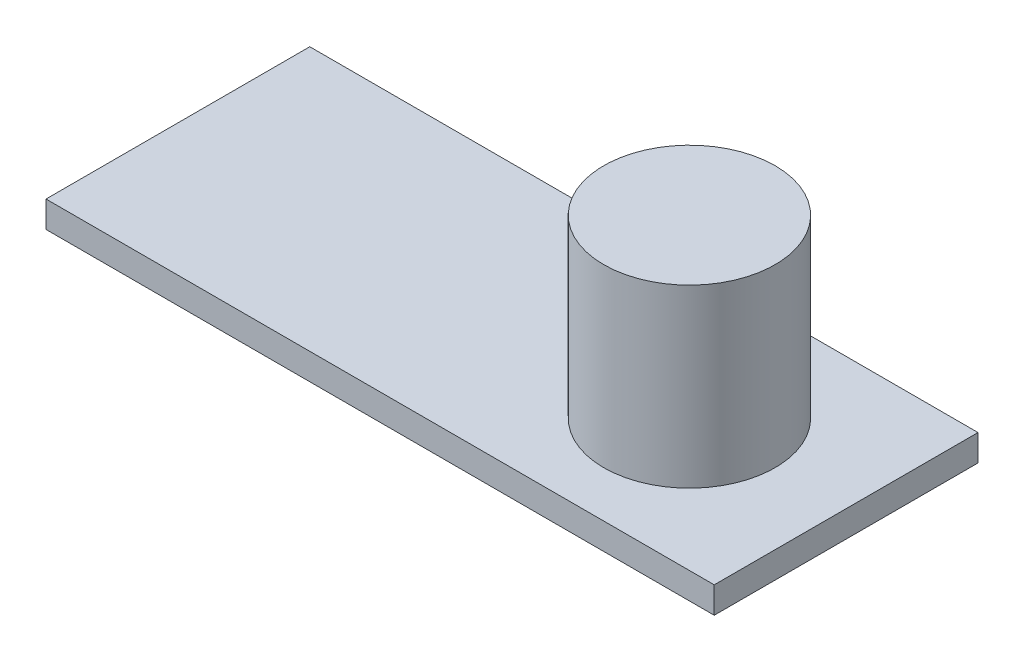
ISO-10303-21;
HEADER;
FILE_DESCRIPTION(('STEP AP214'),'2;1');
FILE_NAME('part.step','',(''),(''),'','','');
FILE_SCHEMA(('AUTOMOTIVE_DESIGN { 1 0 10303 214 1 1 1 1 }'));
ENDSEC;
DATA;
#1=APPLICATION_CONTEXT('core data for automotive mechanical design processes');
#2=APPLICATION_PROTOCOL_DEFINITION('international standard','automotive_design',2000,#1);
#3=PRODUCT_CONTEXT('',#1,'mechanical');
#4=PRODUCT('Part','Part','',(#3));
#5=PRODUCT_RELATED_PRODUCT_CATEGORY('part','',(#4));
#6=PRODUCT_DEFINITION_FORMATION('','',#4);
#7=PRODUCT_DEFINITION_CONTEXT('part definition',#1,'design');
#8=PRODUCT_DEFINITION('design','',#6,#7);
#9=PRODUCT_DEFINITION_SHAPE('','',#8);
#10=(LENGTH_UNIT() NAMED_UNIT(*) SI_UNIT(.MILLI.,.METRE.));
#11=(NAMED_UNIT(*) PLANE_ANGLE_UNIT() SI_UNIT($,.RADIAN.));
#12=(NAMED_UNIT(*) SI_UNIT($,.STERADIAN.) SOLID_ANGLE_UNIT());
#13=UNCERTAINTY_MEASURE_WITH_UNIT(LENGTH_MEASURE(1.E-05),#10,'distance_accuracy_value','');
#14=(GEOMETRIC_REPRESENTATION_CONTEXT(3) GLOBAL_UNCERTAINTY_ASSIGNED_CONTEXT((#13)) GLOBAL_UNIT_ASSIGNED_CONTEXT((#10,
#11,#12)) REPRESENTATION_CONTEXT('',''));
#15=CARTESIAN_POINT('',(0.,0.,0.));
#16=DIRECTION('',(0.,0.,1.));
#17=DIRECTION('',(1.,0.,0.));
#18=AXIS2_PLACEMENT_3D('',#15,#16,#17);
#19=CARTESIAN_POINT('',(0.,-1.5,0.));
#20=DIRECTION('',(0.,1.,0.));
#21=DIRECTION('',(0.,0.,1.));
#22=AXIS2_PLACEMENT_3D('',#19,#20,#21);
#23=PLANE('',#22);
#24=DIRECTION('',(-1.,0.,0.));
#25=VECTOR('',#24,1.);
#26=CARTESIAN_POINT('',(0.,-1.5,-7.5));
#27=LINE('',#26,#25);
#28=CARTESIAN_POINT('',(19.,-1.5,-7.5));
#29=VERTEX_POINT('',#28);
#30=CARTESIAN_POINT('',(-19.,-1.5,-7.5));
#31=VERTEX_POINT('',#30);
#32=EDGE_CURVE('E165',#29,#31,#27,.T.);
#33=ORIENTED_EDGE('',*,*,#32,.F.);
#34=DIRECTION('',(0.,0.,1.));
#35=VECTOR('',#34,1.);
#36=CARTESIAN_POINT('',(19.,-1.5,0.));
#37=LINE('',#36,#35);
#38=CARTESIAN_POINT('',(19.,-1.5,7.5));
#39=VERTEX_POINT('',#38);
#40=EDGE_CURVE('E152',#29,#39,#37,.T.);
#41=ORIENTED_EDGE('',*,*,#40,.T.);
#42=DIRECTION('',(-1.,0.,0.));
#43=VECTOR('',#42,1.);
#44=CARTESIAN_POINT('',(0.,-1.5,7.5));
#45=LINE('',#44,#43);
#46=CARTESIAN_POINT('',(-19.,-1.5,7.5));
#47=VERTEX_POINT('',#46);
#48=EDGE_CURVE('E148',#39,#47,#45,.T.);
#49=ORIENTED_EDGE('',*,*,#48,.T.);
#50=DIRECTION('',(0.,0.,1.));
#51=VECTOR('',#50,1.);
#52=CARTESIAN_POINT('',(-19.,-1.5,0.));
#53=LINE('',#52,#51);
#54=EDGE_CURVE('E151',#31,#47,#53,.T.);
#55=ORIENTED_EDGE('',*,*,#54,.F.);
#56=EDGE_LOOP('',(#33,#41,#49,#55));
#57=FACE_BOUND('',#56,.T.);
#58=ADVANCED_FACE('F101',(#57),#23,.F.);
#59=CARTESIAN_POINT('',(0.,0.,0.));
#60=DIRECTION('',(0.,1.,0.));
#61=DIRECTION('',(0.,0.,1.));
#62=AXIS2_PLACEMENT_3D('',#59,#60,#61);
#63=PLANE('',#62);
#64=CARTESIAN_POINT('',(10.09,0.,0.));
#65=DIRECTION('',(0.,1.,0.));
#66=DIRECTION('',(0.,0.,1.));
#67=AXIS2_PLACEMENT_3D('',#64,#65,#66);
#68=CIRCLE('',#67,4.875);
#69=CARTESIAN_POINT('',(10.09,0.,4.875));
#70=VERTEX_POINT('',#69);
#71=EDGE_CURVE('E289',#70,#70,#68,.T.);
#72=ORIENTED_EDGE('',*,*,#71,.F.);
#73=EDGE_LOOP('',(#72));
#74=FACE_BOUND('',#73,.T.);
#75=DIRECTION('',(-1.,0.,0.));
#76=VECTOR('',#75,1.);
#77=CARTESIAN_POINT('',(0.,0.,-7.5));
#78=LINE('',#77,#76);
#79=CARTESIAN_POINT('',(19.,0.,-7.5));
#80=VERTEX_POINT('',#79);
#81=CARTESIAN_POINT('',(-19.,0.,-7.5));
#82=VERTEX_POINT('',#81);
#83=EDGE_CURVE('E173',#80,#82,#78,.T.);
#84=ORIENTED_EDGE('',*,*,#83,.T.);
#85=DIRECTION('',(0.,0.,1.));
#86=VECTOR('',#85,1.);
#87=CARTESIAN_POINT('',(-19.,0.,0.));
#88=LINE('',#87,#86);
#89=CARTESIAN_POINT('',(-19.,0.,7.5));
#90=VERTEX_POINT('',#89);
#91=EDGE_CURVE('E177',#82,#90,#88,.T.);
#92=ORIENTED_EDGE('',*,*,#91,.T.);
#93=DIRECTION('',(-1.,0.,0.));
#94=VECTOR('',#93,1.);
#95=CARTESIAN_POINT('',(0.,0.,7.5));
#96=LINE('',#95,#94);
#97=CARTESIAN_POINT('',(19.,0.,7.5));
#98=VERTEX_POINT('',#97);
#99=EDGE_CURVE('E160',#98,#90,#96,.T.);
#100=ORIENTED_EDGE('',*,*,#99,.F.);
#101=DIRECTION('',(0.,0.,1.));
#102=VECTOR('',#101,1.);
#103=CARTESIAN_POINT('',(19.,0.,0.));
#104=LINE('',#103,#102);
#105=EDGE_CURVE('E136',#80,#98,#104,.T.);
#106=ORIENTED_EDGE('',*,*,#105,.F.);
#107=EDGE_LOOP('',(#84,#92,#100,#106));
#108=FACE_BOUND('',#107,.T.);
#109=ADVANCED_FACE('F187',(#74,#108),#63,.T.);
#110=CARTESIAN_POINT('',(19.,-1.5,0.));
#111=DIRECTION('',(-1.,0.,0.));
#112=DIRECTION('',(0.,0.,1.));
#113=AXIS2_PLACEMENT_3D('',#110,#111,#112);
#114=PLANE('',#113);
#115=ORIENTED_EDGE('',*,*,#105,.T.);
#116=DIRECTION('',(0.,1.,0.));
#117=VECTOR('',#116,1.);
#118=CARTESIAN_POINT('',(19.,-1.5,7.5));
#119=LINE('',#118,#117);
#120=EDGE_CURVE('E112',#39,#98,#119,.T.);
#121=ORIENTED_EDGE('',*,*,#120,.F.);
#122=ORIENTED_EDGE('',*,*,#40,.F.);
#123=DIRECTION('',(0.,1.,0.));
#124=VECTOR('',#123,1.);
#125=CARTESIAN_POINT('',(19.,-1.5,-7.5));
#126=LINE('',#125,#124);
#127=EDGE_CURVE('E12',#29,#80,#126,.T.);
#128=ORIENTED_EDGE('',*,*,#127,.T.);
#129=EDGE_LOOP('',(#115,#121,#122,#128));
#130=FACE_BOUND('',#129,.T.);
#131=ADVANCED_FACE('F201',(#130),#114,.F.);
#132=CARTESIAN_POINT('',(0.,-1.5,7.5));
#133=DIRECTION('',(0.,0.,-1.));
#134=DIRECTION('',(-1.,0.,0.));
#135=AXIS2_PLACEMENT_3D('',#132,#133,#134);
#136=PLANE('',#135);
#137=ORIENTED_EDGE('',*,*,#99,.T.);
#138=DIRECTION('',(0.,1.,0.));
#139=VECTOR('',#138,1.);
#140=CARTESIAN_POINT('',(-19.,-1.5,7.5));
#141=LINE('',#140,#139);
#142=EDGE_CURVE('E157',#47,#90,#141,.T.);
#143=ORIENTED_EDGE('',*,*,#142,.F.);
#144=ORIENTED_EDGE('',*,*,#48,.F.);
#145=ORIENTED_EDGE('',*,*,#120,.T.);
#146=EDGE_LOOP('',(#137,#143,#144,#145));
#147=FACE_BOUND('',#146,.T.);
#148=ADVANCED_FACE('F158',(#147),#136,.F.);
#149=CARTESIAN_POINT('',(-19.,-1.5,0.));
#150=DIRECTION('',(-1.,0.,0.));
#151=DIRECTION('',(0.,0.,1.));
#152=AXIS2_PLACEMENT_3D('',#149,#150,#151);
#153=PLANE('',#152);
#154=ORIENTED_EDGE('',*,*,#91,.F.);
#155=DIRECTION('',(0.,1.,0.));
#156=VECTOR('',#155,1.);
#157=CARTESIAN_POINT('',(-19.,-1.5,-7.5));
#158=LINE('',#157,#156);
#159=EDGE_CURVE('E105',#31,#82,#158,.T.);
#160=ORIENTED_EDGE('',*,*,#159,.F.);
#161=ORIENTED_EDGE('',*,*,#54,.T.);
#162=ORIENTED_EDGE('',*,*,#142,.T.);
#163=EDGE_LOOP('',(#154,#160,#161,#162));
#164=FACE_BOUND('',#163,.T.);
#165=ADVANCED_FACE('F163',(#164),#153,.T.);
#166=CARTESIAN_POINT('',(0.,-1.5,-7.5));
#167=DIRECTION('',(0.,0.,-1.));
#168=DIRECTION('',(-1.,0.,0.));
#169=AXIS2_PLACEMENT_3D('',#166,#167,#168);
#170=PLANE('',#169);
#171=ORIENTED_EDGE('',*,*,#83,.F.);
#172=ORIENTED_EDGE('',*,*,#127,.F.);
#173=ORIENTED_EDGE('',*,*,#32,.T.);
#174=ORIENTED_EDGE('',*,*,#159,.T.);
#175=EDGE_LOOP('',(#171,#172,#173,#174));
#176=FACE_BOUND('',#175,.T.);
#177=ADVANCED_FACE('F103',(#176),#170,.T.);
#178=CARTESIAN_POINT('',(10.09,10.,0.));
#179=DIRECTION('',(0.,-1.,0.));
#180=DIRECTION('',(0.,0.,-1.));
#181=AXIS2_PLACEMENT_3D('',#178,#179,#180);
#182=CYLINDRICAL_SURFACE('',#181,4.875);
#183=CARTESIAN_POINT('',(10.09,10.,0.));
#184=DIRECTION('',(0.,1.,0.));
#185=DIRECTION('',(0.,0.,1.));
#186=AXIS2_PLACEMENT_3D('',#183,#184,#185);
#187=CIRCLE('',#186,4.875);
#188=CARTESIAN_POINT('',(10.09,10.,4.875));
#189=VERTEX_POINT('',#188);
#190=EDGE_CURVE('E178',#189,#189,#187,.T.);
#191=ORIENTED_EDGE('',*,*,#190,.F.);
#192=EDGE_LOOP('',(#191));
#193=FACE_BOUND('',#192,.T.);
#194=ORIENTED_EDGE('',*,*,#71,.T.);
#195=EDGE_LOOP('',(#194));
#196=FACE_BOUND('',#195,.T.);
#197=ADVANCED_FACE('F190',(#193,#196),#182,.T.);
#198=CARTESIAN_POINT('',(0.,10.,0.));
#199=DIRECTION('',(0.,1.,0.));
#200=DIRECTION('',(0.,0.,1.));
#201=AXIS2_PLACEMENT_3D('',#198,#199,#200);
#202=PLANE('',#201);
#203=ORIENTED_EDGE('',*,*,#190,.T.);
#204=EDGE_LOOP('',(#203));
#205=FACE_BOUND('',#204,.T.);
#206=ADVANCED_FACE('F195',(#205),#202,.T.);
#207=CLOSED_SHELL('',(#58,#109,#131,#148,#165,#177,#197,#206));
#208=MANIFOLD_SOLID_BREP('B2',#207);
#209=ADVANCED_BREP_SHAPE_REPRESENTATION('',(#18,#208),#14);
#210=SHAPE_DEFINITION_REPRESENTATION(#9,#209);
ENDSEC;
END-ISO-10303-21;
